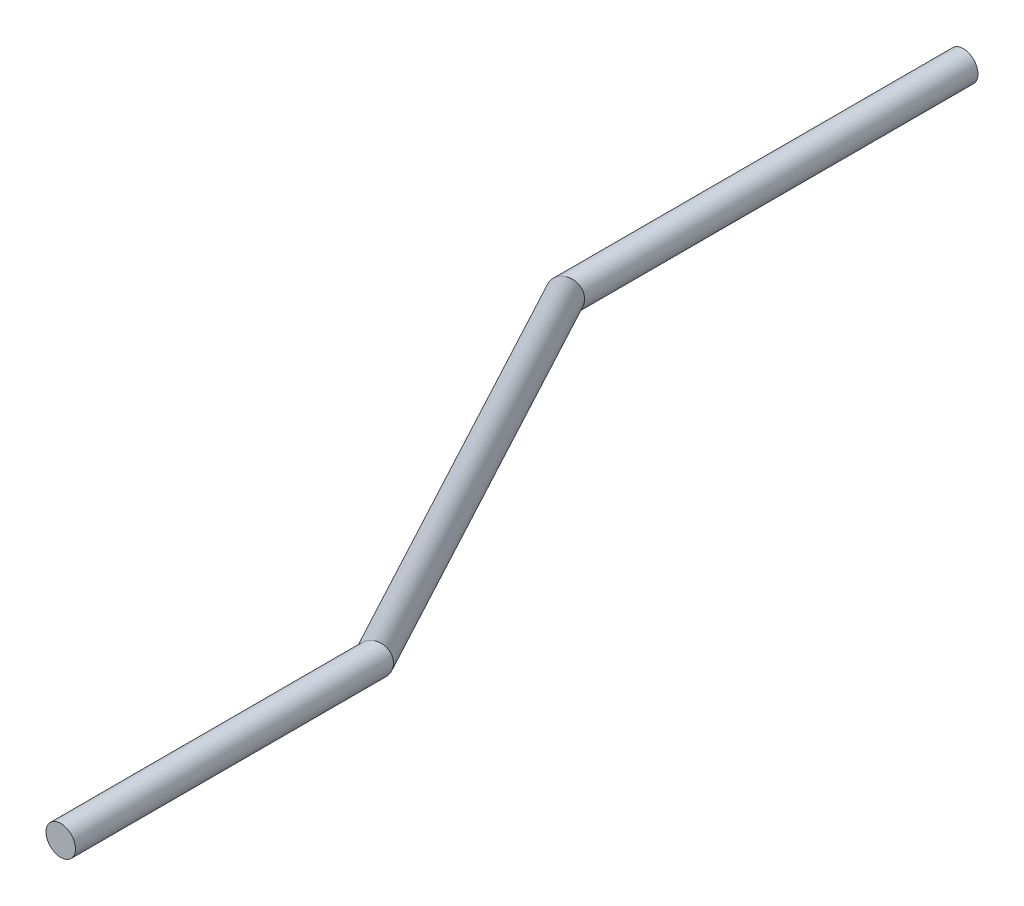
ISO-10303-21;
HEADER;
FILE_DESCRIPTION(('STEP AP214'),'2;1');
FILE_NAME('part.step','',(''),(''),'','','');
FILE_SCHEMA(('AUTOMOTIVE_DESIGN { 1 0 10303 214 1 1 1 1 }'));
ENDSEC;
DATA;
#1=APPLICATION_CONTEXT('core data for automotive mechanical design processes');
#2=APPLICATION_PROTOCOL_DEFINITION('international standard','automotive_design',2000,#1);
#3=PRODUCT_CONTEXT('',#1,'mechanical');
#4=PRODUCT('Part','Part','',(#3));
#5=PRODUCT_RELATED_PRODUCT_CATEGORY('part','',(#4));
#6=PRODUCT_DEFINITION_FORMATION('','',#4);
#7=PRODUCT_DEFINITION_CONTEXT('part definition',#1,'design');
#8=PRODUCT_DEFINITION('design','',#6,#7);
#9=PRODUCT_DEFINITION_SHAPE('','',#8);
#10=(LENGTH_UNIT() NAMED_UNIT(*) SI_UNIT(.MILLI.,.METRE.));
#11=(NAMED_UNIT(*) PLANE_ANGLE_UNIT() SI_UNIT($,.RADIAN.));
#12=(NAMED_UNIT(*) SI_UNIT($,.STERADIAN.) SOLID_ANGLE_UNIT());
#13=UNCERTAINTY_MEASURE_WITH_UNIT(LENGTH_MEASURE(1.E-05),#10,'distance_accuracy_value','');
#14=(GEOMETRIC_REPRESENTATION_CONTEXT(3) GLOBAL_UNCERTAINTY_ASSIGNED_CONTEXT((#13)) GLOBAL_UNIT_ASSIGNED_CONTEXT((#10,
#11,#12)) REPRESENTATION_CONTEXT('',''));
#15=CARTESIAN_POINT('',(0.,0.,0.));
#16=DIRECTION('',(0.,0.,1.));
#17=DIRECTION('',(1.,0.,0.));
#18=AXIS2_PLACEMENT_3D('',#15,#16,#17);
#19=CARTESIAN_POINT('',(-11.8201907708266,9.23488441407173,38.7099336884413));
#20=DIRECTION('',(0.,0.,-1.));
#21=DIRECTION('',(-1.,0.,0.));
#22=AXIS2_PLACEMENT_3D('',#19,#20,#21);
#23=PLANE('',#22);
#24=CARTESIAN_POINT('',(-11.8201907708266,9.23488441407173,38.7099336884413));
#25=DIRECTION('',(0.,0.,-1.));
#26=DIRECTION('',(-1.,0.,0.));
#27=AXIS2_PLACEMENT_3D('',#24,#25,#26);
#28=CIRCLE('',#27,0.6);
#29=CARTESIAN_POINT('',(-12.4201907708266,9.23488441407173,38.7099336884413));
#30=VERTEX_POINT('',#29);
#31=EDGE_CURVE('E46',#30,#30,#28,.T.);
#32=ORIENTED_EDGE('',*,*,#31,.F.);
#33=EDGE_LOOP('',(#32));
#34=FACE_BOUND('',#33,.T.);
#35=ADVANCED_FACE('F43',(#34),#23,.F.);
#36=CARTESIAN_POINT('',(-30.,0.,-16.2));
#37=DIRECTION('',(0.,0.,-1.));
#38=DIRECTION('',(-1.,0.,0.));
#39=AXIS2_PLACEMENT_3D('',#36,#37,#38);
#40=PLANE('',#39);
#41=CARTESIAN_POINT('',(-30.,0.,-16.2));
#42=DIRECTION('',(0.,0.,-1.));
#43=DIRECTION('',(-1.,0.,0.));
#44=AXIS2_PLACEMENT_3D('',#41,#42,#43);
#45=CIRCLE('',#44,0.6);
#46=CARTESIAN_POINT('',(-30.6,0.,-16.2));
#47=VERTEX_POINT('',#46);
#48=EDGE_CURVE('E49',#47,#47,#45,.T.);
#49=ORIENTED_EDGE('',*,*,#48,.T.);
#50=EDGE_LOOP('',(#49));
#51=FACE_BOUND('',#50,.T.);
#52=ADVANCED_FACE('F66',(#51),#40,.T.);
#53=CARTESIAN_POINT('',(-11.8201907708266,9.23488441407173,25.4497512375787));
#54=DIRECTION('',(0.,0.,1.));
#55=DIRECTION('',(1.,0.,0.));
#56=AXIS2_PLACEMENT_3D('',#53,#54,#55);
#57=CYLINDRICAL_SURFACE('',#56,0.6);
#58=CARTESIAN_POINT('',(-11.8201907708266,9.23488441407173,25.9599336884413));
#59=DIRECTION('',(0.291359375766482,0.148003211928198,0.945095108130342));
#60=DIRECTION('',(0.842613808864945,0.428026555860747,-0.326795404784243));
#61=AXIS2_PLACEMENT_3D('',#58,#59,#60);
#62=ELLIPSE('',#61,0.634856740700907,0.6);
#63=CARTESIAN_POINT('',(-11.2852517144611,9.50661995825892,25.7524654228839));
#64=VERTEX_POINT('',#63);
#65=EDGE_CURVE('E54',#64,#64,#62,.T.);
#66=ORIENTED_EDGE('',*,*,#65,.T.);
#67=EDGE_LOOP('',(#66));
#68=FACE_BOUND('',#67,.T.);
#69=ORIENTED_EDGE('',*,*,#31,.T.);
#70=EDGE_LOOP('',(#69));
#71=FACE_BOUND('',#70,.T.);
#72=ADVANCED_FACE('F64',(#68,#71),#57,.T.);
#73=CARTESIAN_POINT('',(-30.2809700473456,-0.14272569521186,-0.401212339776622));
#74=DIRECTION('',(0.550724641489625,0.279754223161837,0.786409526823805));
#75=DIRECTION('',(0.819115454756364,0.,-0.573628688072062));
#76=AXIS2_PLACEMENT_3D('',#73,#74,#75);
#77=CYLINDRICAL_SURFACE('',#76,0.6);
#78=CARTESIAN_POINT('',(-30.,0.,0.));
#79=DIRECTION('',(0.291359375766483,0.148003211928198,0.945095108130342));
#80=DIRECTION('',(-0.842613808864945,-0.428026555860747,0.326795404784243));
#81=AXIS2_PLACEMENT_3D('',#78,#79,#80);
#82=ELLIPSE('',#81,0.634856740700907,0.6);
#83=CARTESIAN_POINT('',(-30.5349390563656,-0.271735544187195,0.207468265557358));
#84=VERTEX_POINT('',#83);
#85=EDGE_CURVE('E11',#84,#84,#82,.T.);
#86=ORIENTED_EDGE('',*,*,#85,.T.);
#87=EDGE_LOOP('',(#86));
#88=FACE_BOUND('',#87,.T.);
#89=ORIENTED_EDGE('',*,*,#65,.F.);
#90=EDGE_LOOP('',(#89));
#91=FACE_BOUND('',#90,.T.);
#92=ADVANCED_FACE('F74',(#88,#91),#77,.T.);
#93=CARTESIAN_POINT('',(-30.,0.,-16.2));
#94=DIRECTION('',(0.,0.,1.));
#95=DIRECTION('',(1.,0.,0.));
#96=AXIS2_PLACEMENT_3D('',#93,#94,#95);
#97=CYLINDRICAL_SURFACE('',#96,0.6);
#98=ORIENTED_EDGE('',*,*,#48,.F.);
#99=EDGE_LOOP('',(#98));
#100=FACE_BOUND('',#99,.T.);
#101=ORIENTED_EDGE('',*,*,#85,.F.);
#102=EDGE_LOOP('',(#101));
#103=FACE_BOUND('',#102,.T.);
#104=ADVANCED_FACE('F71',(#100,#103),#97,.T.);
#105=CLOSED_SHELL('',(#35,#52,#72,#92,#104));
#106=MANIFOLD_SOLID_BREP('B2',#105);
#107=ADVANCED_BREP_SHAPE_REPRESENTATION('',(#18,#106),#14);
#108=SHAPE_DEFINITION_REPRESENTATION(#9,#107);
ENDSEC;
END-ISO-10303-21;
